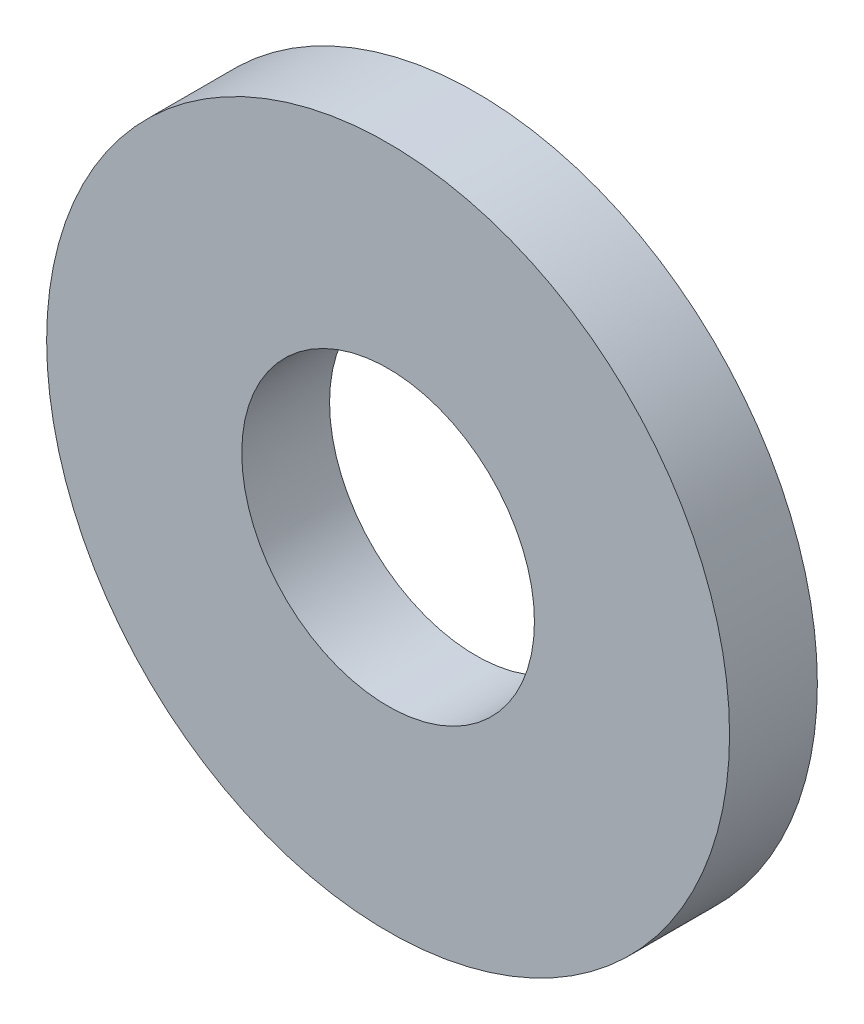
ISO-10303-21;
HEADER;
FILE_DESCRIPTION(('STEP AP214'),'2;1');
FILE_NAME('part.step','',(''),(''),'','','');
FILE_SCHEMA(('AUTOMOTIVE_DESIGN { 1 0 10303 214 1 1 1 1 }'));
ENDSEC;
DATA;
#1=APPLICATION_CONTEXT('core data for automotive mechanical design processes');
#2=APPLICATION_PROTOCOL_DEFINITION('international standard','automotive_design',2000,#1);
#3=PRODUCT_CONTEXT('',#1,'mechanical');
#4=PRODUCT('Part','Part','',(#3));
#5=PRODUCT_RELATED_PRODUCT_CATEGORY('part','',(#4));
#6=PRODUCT_DEFINITION_FORMATION('','',#4);
#7=PRODUCT_DEFINITION_CONTEXT('part definition',#1,'design');
#8=PRODUCT_DEFINITION('design','',#6,#7);
#9=PRODUCT_DEFINITION_SHAPE('','',#8);
#10=(LENGTH_UNIT() NAMED_UNIT(*) SI_UNIT(.MILLI.,.METRE.));
#11=(NAMED_UNIT(*) PLANE_ANGLE_UNIT() SI_UNIT($,.RADIAN.));
#12=(NAMED_UNIT(*) SI_UNIT($,.STERADIAN.) SOLID_ANGLE_UNIT());
#13=UNCERTAINTY_MEASURE_WITH_UNIT(LENGTH_MEASURE(1.E-05),#10,'distance_accuracy_value','');
#14=(GEOMETRIC_REPRESENTATION_CONTEXT(3) GLOBAL_UNCERTAINTY_ASSIGNED_CONTEXT((#13)) GLOBAL_UNIT_ASSIGNED_CONTEXT((#10,
#11,#12)) REPRESENTATION_CONTEXT('',''));
#15=CARTESIAN_POINT('',(0.,0.,0.));
#16=DIRECTION('',(0.,0.,1.));
#17=DIRECTION('',(1.,0.,0.));
#18=AXIS2_PLACEMENT_3D('',#15,#16,#17);
#19=CARTESIAN_POINT('',(0.,0.,0.457199999999999));
#20=DIRECTION('',(0.,0.,1.));
#21=DIRECTION('',(1.,0.,0.));
#22=AXIS2_PLACEMENT_3D('',#19,#20,#21);
#23=PLANE('',#22);
#24=CARTESIAN_POINT('',(0.,0.,0.457199999999999));
#25=DIRECTION('',(0.,0.,1.));
#26=DIRECTION('',(1.,0.,0.));
#27=AXIS2_PLACEMENT_3D('',#24,#25,#26);
#28=CIRCLE('',#27,3.556);
#29=CARTESIAN_POINT('',(3.556,0.,0.457199999999999));
#30=VERTEX_POINT('',#29);
#31=EDGE_CURVE('E10',#30,#30,#28,.T.);
#32=ORIENTED_EDGE('',*,*,#31,.T.);
#33=EDGE_LOOP('',(#32));
#34=FACE_BOUND('',#33,.T.);
#35=CARTESIAN_POINT('',(0.,0.,0.457199999999999));
#36=DIRECTION('',(0.,0.,1.));
#37=DIRECTION('',(1.,0.,0.));
#38=AXIS2_PLACEMENT_3D('',#35,#36,#37);
#39=CIRCLE('',#38,1.524);
#40=CARTESIAN_POINT('',(1.524,0.,0.457199999999999));
#41=VERTEX_POINT('',#40);
#42=EDGE_CURVE('E39',#41,#41,#39,.T.);
#43=ORIENTED_EDGE('',*,*,#42,.F.);
#44=EDGE_LOOP('',(#43));
#45=FACE_BOUND('',#44,.T.);
#46=ADVANCED_FACE('F32',(#34,#45),#23,.T.);
#47=CARTESIAN_POINT('',(0.,0.,0.457199999999999));
#48=DIRECTION('',(0.,0.,-1.));
#49=DIRECTION('',(-1.,0.,0.));
#50=AXIS2_PLACEMENT_3D('',#47,#48,#49);
#51=CYLINDRICAL_SURFACE('',#50,3.556);
#52=ORIENTED_EDGE('',*,*,#31,.F.);
#53=EDGE_LOOP('',(#52));
#54=FACE_BOUND('',#53,.T.);
#55=CARTESIAN_POINT('',(0.,0.,-0.457200000000001));
#56=DIRECTION('',(0.,0.,1.));
#57=DIRECTION('',(1.,0.,0.));
#58=AXIS2_PLACEMENT_3D('',#55,#56,#57);
#59=CIRCLE('',#58,3.556);
#60=CARTESIAN_POINT('',(3.556,0.,-0.457200000000001));
#61=VERTEX_POINT('',#60);
#62=EDGE_CURVE('E43',#61,#61,#59,.T.);
#63=ORIENTED_EDGE('',*,*,#62,.T.);
#64=EDGE_LOOP('',(#63));
#65=FACE_BOUND('',#64,.T.);
#66=ADVANCED_FACE('F34',(#54,#65),#51,.T.);
#67=CARTESIAN_POINT('',(0.,0.,0.457199999999999));
#68=DIRECTION('',(0.,0.,-1.));
#69=DIRECTION('',(-1.,0.,0.));
#70=AXIS2_PLACEMENT_3D('',#67,#68,#69);
#71=CYLINDRICAL_SURFACE('',#70,1.524);
#72=ORIENTED_EDGE('',*,*,#42,.T.);
#73=EDGE_LOOP('',(#72));
#74=FACE_BOUND('',#73,.T.);
#75=CARTESIAN_POINT('',(0.,0.,-0.457200000000001));
#76=DIRECTION('',(0.,0.,1.));
#77=DIRECTION('',(1.,0.,0.));
#78=AXIS2_PLACEMENT_3D('',#75,#76,#77);
#79=CIRCLE('',#78,1.524);
#80=CARTESIAN_POINT('',(1.524,0.,-0.457200000000001));
#81=VERTEX_POINT('',#80);
#82=EDGE_CURVE('E47',#81,#81,#79,.T.);
#83=ORIENTED_EDGE('',*,*,#82,.F.);
#84=EDGE_LOOP('',(#83));
#85=FACE_BOUND('',#84,.T.);
#86=ADVANCED_FACE('F56',(#74,#85),#71,.F.);
#87=CARTESIAN_POINT('',(0.,0.,-0.457200000000001));
#88=DIRECTION('',(0.,0.,1.));
#89=DIRECTION('',(1.,0.,0.));
#90=AXIS2_PLACEMENT_3D('',#87,#88,#89);
#91=PLANE('',#90);
#92=ORIENTED_EDGE('',*,*,#82,.T.);
#93=EDGE_LOOP('',(#92));
#94=FACE_BOUND('',#93,.T.);
#95=ORIENTED_EDGE('',*,*,#62,.F.);
#96=EDGE_LOOP('',(#95));
#97=FACE_BOUND('',#96,.T.);
#98=ADVANCED_FACE('F53',(#94,#97),#91,.F.);
#99=CLOSED_SHELL('',(#46,#66,#86,#98));
#100=MANIFOLD_SOLID_BREP('B2',#99);
#101=ADVANCED_BREP_SHAPE_REPRESENTATION('',(#18,#100),#14);
#102=SHAPE_DEFINITION_REPRESENTATION(#9,#101);
ENDSEC;
END-ISO-10303-21;
